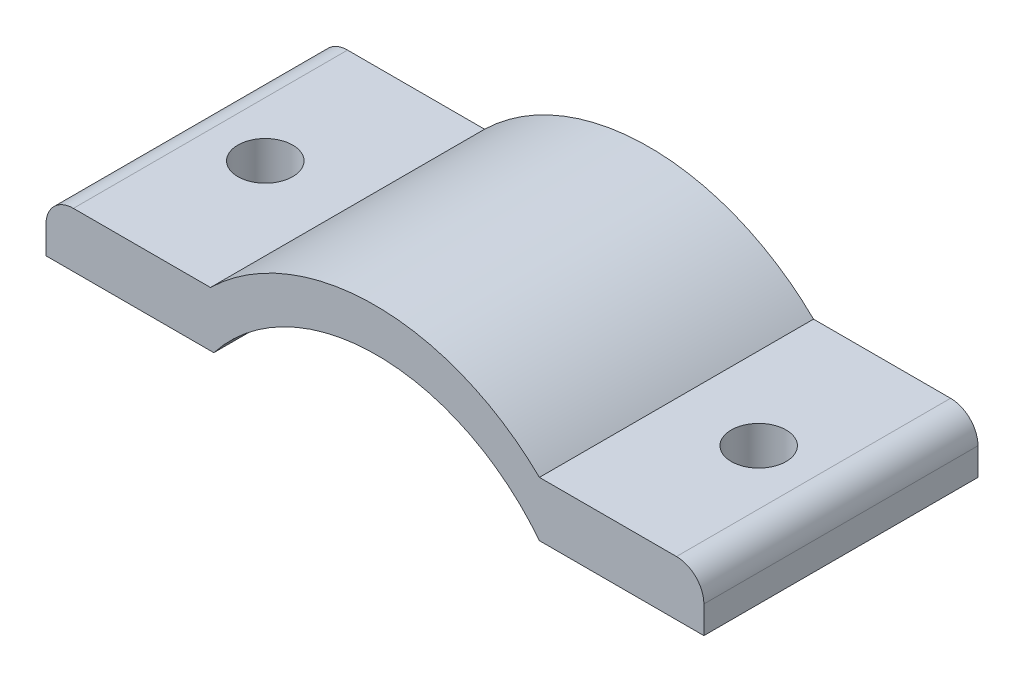
ISO-10303-21;
HEADER;
FILE_DESCRIPTION(('STEP AP214'),'2;1');
FILE_NAME('part.step','',(''),(''),'','','');
FILE_SCHEMA(('AUTOMOTIVE_DESIGN { 1 0 10303 214 1 1 1 1 }'));
ENDSEC;
DATA;
#1=APPLICATION_CONTEXT('core data for automotive mechanical design processes');
#2=APPLICATION_PROTOCOL_DEFINITION('international standard','automotive_design',2000,#1);
#3=PRODUCT_CONTEXT('',#1,'mechanical');
#4=PRODUCT('Part','Part','',(#3));
#5=PRODUCT_RELATED_PRODUCT_CATEGORY('part','',(#4));
#6=PRODUCT_DEFINITION_FORMATION('','',#4);
#7=PRODUCT_DEFINITION_CONTEXT('part definition',#1,'design');
#8=PRODUCT_DEFINITION('design','',#6,#7);
#9=PRODUCT_DEFINITION_SHAPE('','',#8);
#10=(LENGTH_UNIT() NAMED_UNIT(*) SI_UNIT(.MILLI.,.METRE.));
#11=(NAMED_UNIT(*) PLANE_ANGLE_UNIT() SI_UNIT($,.RADIAN.));
#12=(NAMED_UNIT(*) SI_UNIT($,.STERADIAN.) SOLID_ANGLE_UNIT());
#13=UNCERTAINTY_MEASURE_WITH_UNIT(LENGTH_MEASURE(1.E-05),#10,'distance_accuracy_value','');
#14=(GEOMETRIC_REPRESENTATION_CONTEXT(3) GLOBAL_UNCERTAINTY_ASSIGNED_CONTEXT((#13)) GLOBAL_UNIT_ASSIGNED_CONTEXT((#10,
#11,#12)) REPRESENTATION_CONTEXT('',''));
#15=CARTESIAN_POINT('',(0.,0.,0.));
#16=DIRECTION('',(0.,0.,1.));
#17=DIRECTION('',(1.,0.,0.));
#18=AXIS2_PLACEMENT_3D('',#15,#16,#17);
#19=CARTESIAN_POINT('',(-19.5403565974855,0.,10.));
#20=DIRECTION('',(0.,-1.,0.));
#21=DIRECTION('',(0.,0.,-1.));
#22=AXIS2_PLACEMENT_3D('',#19,#20,#21);
#23=PLANE('',#22);
#24=CARTESIAN_POINT('',(-16.5403565974855,0.,5.));
#25=DIRECTION('',(0.,1.,0.));
#26=DIRECTION('',(0.,0.,1.));
#27=AXIS2_PLACEMENT_3D('',#24,#25,#26);
#28=CIRCLE('',#27,1.);
#29=CARTESIAN_POINT('',(-16.5403565974855,0.,6.));
#30=VERTEX_POINT('',#29);
#31=EDGE_CURVE('E306',#30,#30,#28,.T.);
#32=ORIENTED_EDGE('',*,*,#31,.F.);
#33=EDGE_LOOP('',(#32));
#34=FACE_BOUND('',#33,.T.);
#35=DIRECTION('',(-1.,0.,0.));
#36=VECTOR('',#35,1.);
#37=CARTESIAN_POINT('',(-19.5403565974855,0.,0.));
#38=LINE('',#37,#36);
#39=CARTESIAN_POINT('',(-13.5403565974855,0.,0.));
#40=VERTEX_POINT('',#39);
#41=CARTESIAN_POINT('',(-18.5403565974855,0.,0.));
#42=VERTEX_POINT('',#41);
#43=EDGE_CURVE('E167',#40,#42,#38,.T.);
#44=ORIENTED_EDGE('',*,*,#43,.T.);
#45=DIRECTION('',(0.,0.,-1.));
#46=VECTOR('',#45,1.);
#47=CARTESIAN_POINT('',(-18.5403565974855,0.,10.));
#48=LINE('',#47,#46);
#49=CARTESIAN_POINT('',(-18.5403565974855,0.,10.));
#50=VERTEX_POINT('',#49);
#51=EDGE_CURVE('E11',#42,#50,#48,.F.);
#52=ORIENTED_EDGE('',*,*,#51,.T.);
#53=DIRECTION('',(-1.,0.,0.));
#54=VECTOR('',#53,1.);
#55=CARTESIAN_POINT('',(-19.5403565974855,0.,10.));
#56=LINE('',#55,#54);
#57=CARTESIAN_POINT('',(-13.5403565974855,0.,10.));
#58=VERTEX_POINT('',#57);
#59=EDGE_CURVE('E131',#58,#50,#56,.T.);
#60=ORIENTED_EDGE('',*,*,#59,.F.);
#61=DIRECTION('',(0.,0.,-1.));
#62=VECTOR('',#61,1.);
#63=CARTESIAN_POINT('',(-13.5403565974855,0.,10.));
#64=LINE('',#63,#62);
#65=EDGE_CURVE('E166',#58,#40,#64,.T.);
#66=ORIENTED_EDGE('',*,*,#65,.T.);
#67=EDGE_LOOP('',(#44,#52,#60,#66));
#68=FACE_BOUND('',#67,.T.);
#69=ADVANCED_FACE('F45',(#34,#68),#23,.F.);
#70=CARTESIAN_POINT('',(-19.5403565974855,0.,10.));
#71=DIRECTION('',(1.,0.,0.));
#72=DIRECTION('',(0.,0.,-1.));
#73=AXIS2_PLACEMENT_3D('',#70,#71,#72);
#74=PLANE('',#73);
#75=DIRECTION('',(0.,-1.,0.));
#76=VECTOR('',#75,1.);
#77=CARTESIAN_POINT('',(-19.5403565974855,0.,10.));
#78=LINE('',#77,#76);
#79=CARTESIAN_POINT('',(-19.5403565974855,-1.,10.));
#80=VERTEX_POINT('',#79);
#81=CARTESIAN_POINT('',(-19.5403565974855,-2.,10.));
#82=VERTEX_POINT('',#81);
#83=EDGE_CURVE('E120',#80,#82,#78,.T.);
#84=ORIENTED_EDGE('',*,*,#83,.F.);
#85=DIRECTION('',(0.,0.,-1.));
#86=VECTOR('',#85,1.);
#87=CARTESIAN_POINT('',(-19.5403565974855,-1.,10.));
#88=LINE('',#87,#86);
#89=CARTESIAN_POINT('',(-19.5403565974855,-1.,0.));
#90=VERTEX_POINT('',#89);
#91=EDGE_CURVE('E54',#80,#90,#88,.T.);
#92=ORIENTED_EDGE('',*,*,#91,.T.);
#93=DIRECTION('',(0.,-1.,0.));
#94=VECTOR('',#93,1.);
#95=CARTESIAN_POINT('',(-19.5403565974855,0.,0.));
#96=LINE('',#95,#94);
#97=CARTESIAN_POINT('',(-19.5403565974855,-2.,0.));
#98=VERTEX_POINT('',#97);
#99=EDGE_CURVE('E137',#90,#98,#96,.T.);
#100=ORIENTED_EDGE('',*,*,#99,.T.);
#101=DIRECTION('',(0.,0.,-1.));
#102=VECTOR('',#101,1.);
#103=CARTESIAN_POINT('',(-19.5403565974855,-2.,10.));
#104=LINE('',#103,#102);
#105=EDGE_CURVE('E134',#82,#98,#104,.T.);
#106=ORIENTED_EDGE('',*,*,#105,.F.);
#107=EDGE_LOOP('',(#84,#92,#100,#106));
#108=FACE_BOUND('',#107,.T.);
#109=ADVANCED_FACE('F135',(#108),#74,.F.);
#110=CARTESIAN_POINT('',(-19.5403565974855,-2.,10.));
#111=DIRECTION('',(0.,1.,0.));
#112=DIRECTION('',(0.,0.,1.));
#113=AXIS2_PLACEMENT_3D('',#110,#111,#112);
#114=PLANE('',#113);
#115=CARTESIAN_POINT('',(-16.5403565974855,-2.,5.));
#116=DIRECTION('',(0.,1.,0.));
#117=DIRECTION('',(0.,0.,1.));
#118=AXIS2_PLACEMENT_3D('',#115,#116,#117);
#119=CIRCLE('',#118,1.);
#120=CARTESIAN_POINT('',(-16.5403565974855,-2.,6.));
#121=VERTEX_POINT('',#120);
#122=EDGE_CURVE('E170',#121,#121,#119,.T.);
#123=ORIENTED_EDGE('',*,*,#122,.T.);
#124=EDGE_LOOP('',(#123));
#125=FACE_BOUND('',#124,.T.);
#126=DIRECTION('',(1.,0.,0.));
#127=VECTOR('',#126,1.);
#128=CARTESIAN_POINT('',(-19.5403565974855,-2.,0.));
#129=LINE('',#128,#127);
#130=CARTESIAN_POINT('',(-13.4187219149382,-2.,0.));
#131=VERTEX_POINT('',#130);
#132=EDGE_CURVE('E173',#98,#131,#129,.T.);
#133=ORIENTED_EDGE('',*,*,#132,.T.);
#134=DIRECTION('',(0.,0.,-1.));
#135=VECTOR('',#134,1.);
#136=CARTESIAN_POINT('',(-13.4187219149382,-2.,10.));
#137=LINE('',#136,#135);
#138=CARTESIAN_POINT('',(-13.4187219149382,-2.,10.));
#139=VERTEX_POINT('',#138);
#140=EDGE_CURVE('E142',#139,#131,#137,.T.);
#141=ORIENTED_EDGE('',*,*,#140,.F.);
#142=DIRECTION('',(1.,0.,0.));
#143=VECTOR('',#142,1.);
#144=CARTESIAN_POINT('',(-19.5403565974855,-2.,10.));
#145=LINE('',#144,#143);
#146=EDGE_CURVE('E125',#82,#139,#145,.T.);
#147=ORIENTED_EDGE('',*,*,#146,.F.);
#148=ORIENTED_EDGE('',*,*,#105,.T.);
#149=EDGE_LOOP('',(#133,#141,#147,#148));
#150=FACE_BOUND('',#149,.T.);
#151=ADVANCED_FACE('F144',(#125,#150),#114,.F.);
#152=CARTESIAN_POINT('',(-7.47953925621184,-6.63170528512345,10.));
#153=DIRECTION('',(0.,0.,-1.));
#154=DIRECTION('',(-1.,0.,0.));
#155=AXIS2_PLACEMENT_3D('',#152,#153,#154);
#156=CYLINDRICAL_SURFACE('',#155,7.53170528512345);
#157=CARTESIAN_POINT('',(-7.47953925621184,-6.63170528512345,0.));
#158=DIRECTION('',(0.,0.,-1.));
#159=DIRECTION('',(-1.,0.,0.));
#160=AXIS2_PLACEMENT_3D('',#157,#158,#159);
#161=CIRCLE('',#160,7.53170528512345);
#162=CARTESIAN_POINT('',(-1.54035659748547,-2.,0.));
#163=VERTEX_POINT('',#162);
#164=EDGE_CURVE('E176',#131,#163,#161,.T.);
#165=ORIENTED_EDGE('',*,*,#164,.T.);
#166=DIRECTION('',(0.,0.,-1.));
#167=VECTOR('',#166,1.);
#168=CARTESIAN_POINT('',(-1.54035659748547,-2.,10.));
#169=LINE('',#168,#167);
#170=CARTESIAN_POINT('',(-1.54035659748547,-2.,10.));
#171=VERTEX_POINT('',#170);
#172=EDGE_CURVE('E203',#171,#163,#169,.T.);
#173=ORIENTED_EDGE('',*,*,#172,.F.);
#174=CARTESIAN_POINT('',(-7.47953925621184,-6.63170528512345,10.));
#175=DIRECTION('',(0.,0.,-1.));
#176=DIRECTION('',(-1.,0.,0.));
#177=AXIS2_PLACEMENT_3D('',#174,#175,#176);
#178=CIRCLE('',#177,7.53170528512345);
#179=EDGE_CURVE('E148',#139,#171,#178,.T.);
#180=ORIENTED_EDGE('',*,*,#179,.F.);
#181=ORIENTED_EDGE('',*,*,#140,.T.);
#182=EDGE_LOOP('',(#165,#173,#180,#181));
#183=FACE_BOUND('',#182,.T.);
#184=ADVANCED_FACE('F238',(#183),#156,.F.);
#185=CARTESIAN_POINT('',(-1.54035659748547,-2.,10.));
#186=DIRECTION('',(0.,1.,0.));
#187=DIRECTION('',(0.,0.,1.));
#188=AXIS2_PLACEMENT_3D('',#185,#186,#187);
#189=PLANE('',#188);
#190=CARTESIAN_POINT('',(1.45964340251453,-2.,5.));
#191=DIRECTION('',(0.,1.,0.));
#192=DIRECTION('',(0.,0.,1.));
#193=AXIS2_PLACEMENT_3D('',#190,#191,#192);
#194=CIRCLE('',#193,1.);
#195=CARTESIAN_POINT('',(1.45964340251453,-2.,6.));
#196=VERTEX_POINT('',#195);
#197=EDGE_CURVE('E212',#196,#196,#194,.T.);
#198=ORIENTED_EDGE('',*,*,#197,.T.);
#199=EDGE_LOOP('',(#198));
#200=FACE_BOUND('',#199,.T.);
#201=DIRECTION('',(1.,0.,0.));
#202=VECTOR('',#201,1.);
#203=CARTESIAN_POINT('',(-1.54035659748547,-2.,0.));
#204=LINE('',#203,#202);
#205=CARTESIAN_POINT('',(4.45964340251453,-2.,0.));
#206=VERTEX_POINT('',#205);
#207=EDGE_CURVE('E179',#163,#206,#204,.T.);
#208=ORIENTED_EDGE('',*,*,#207,.T.);
#209=DIRECTION('',(0.,0.,-1.));
#210=VECTOR('',#209,1.);
#211=CARTESIAN_POINT('',(4.45964340251453,-2.,10.));
#212=LINE('',#211,#210);
#213=CARTESIAN_POINT('',(4.45964340251453,-2.,10.));
#214=VERTEX_POINT('',#213);
#215=EDGE_CURVE('E199',#214,#206,#212,.T.);
#216=ORIENTED_EDGE('',*,*,#215,.F.);
#217=DIRECTION('',(1.,0.,0.));
#218=VECTOR('',#217,1.);
#219=CARTESIAN_POINT('',(-1.54035659748547,-2.,10.));
#220=LINE('',#219,#218);
#221=EDGE_CURVE('E151',#171,#214,#220,.T.);
#222=ORIENTED_EDGE('',*,*,#221,.F.);
#223=ORIENTED_EDGE('',*,*,#172,.T.);
#224=EDGE_LOOP('',(#208,#216,#222,#223));
#225=FACE_BOUND('',#224,.T.);
#226=ADVANCED_FACE('F245',(#200,#225),#189,.F.);
#227=CARTESIAN_POINT('',(4.45964340251453,-2.,10.));
#228=DIRECTION('',(-1.,0.,0.));
#229=DIRECTION('',(0.,0.,1.));
#230=AXIS2_PLACEMENT_3D('',#227,#228,#229);
#231=PLANE('',#230);
#232=DIRECTION('',(0.,1.,0.));
#233=VECTOR('',#232,1.);
#234=CARTESIAN_POINT('',(4.45964340251453,-2.,0.));
#235=LINE('',#234,#233);
#236=CARTESIAN_POINT('',(4.45964340251453,-1.,0.));
#237=VERTEX_POINT('',#236);
#238=EDGE_CURVE('E182',#206,#237,#235,.T.);
#239=ORIENTED_EDGE('',*,*,#238,.T.);
#240=DIRECTION('',(0.,0.,-1.));
#241=VECTOR('',#240,1.);
#242=CARTESIAN_POINT('',(4.45964340251453,-1.,10.));
#243=LINE('',#242,#241);
#244=CARTESIAN_POINT('',(4.45964340251453,-1.,10.));
#245=VERTEX_POINT('',#244);
#246=EDGE_CURVE('E222',#237,#245,#243,.F.);
#247=ORIENTED_EDGE('',*,*,#246,.T.);
#248=DIRECTION('',(0.,1.,0.));
#249=VECTOR('',#248,1.);
#250=CARTESIAN_POINT('',(4.45964340251453,-2.,10.));
#251=LINE('',#250,#249);
#252=EDGE_CURVE('E157',#214,#245,#251,.T.);
#253=ORIENTED_EDGE('',*,*,#252,.F.);
#254=ORIENTED_EDGE('',*,*,#215,.T.);
#255=EDGE_LOOP('',(#239,#247,#253,#254));
#256=FACE_BOUND('',#255,.T.);
#257=ADVANCED_FACE('F248',(#256),#231,.F.);
#258=CARTESIAN_POINT('',(-1.54035659748547,0.,10.));
#259=DIRECTION('',(0.,-1.,0.));
#260=DIRECTION('',(0.,0.,-1.));
#261=AXIS2_PLACEMENT_3D('',#258,#259,#260);
#262=PLANE('',#261);
#263=CARTESIAN_POINT('',(1.45964340251453,0.,5.));
#264=DIRECTION('',(0.,1.,0.));
#265=DIRECTION('',(0.,0.,1.));
#266=AXIS2_PLACEMENT_3D('',#263,#264,#265);
#267=CIRCLE('',#266,1.);
#268=CARTESIAN_POINT('',(1.45964340251453,0.,6.));
#269=VERTEX_POINT('',#268);
#270=EDGE_CURVE('E309',#269,#269,#267,.T.);
#271=ORIENTED_EDGE('',*,*,#270,.F.);
#272=EDGE_LOOP('',(#271));
#273=FACE_BOUND('',#272,.T.);
#274=DIRECTION('',(-1.,0.,0.));
#275=VECTOR('',#274,1.);
#276=CARTESIAN_POINT('',(-1.54035659748547,0.,10.));
#277=LINE('',#276,#275);
#278=CARTESIAN_POINT('',(3.45964340251453,0.,10.));
#279=VERTEX_POINT('',#278);
#280=CARTESIAN_POINT('',(-1.54035659748547,0.,10.));
#281=VERTEX_POINT('',#280);
#282=EDGE_CURVE('E160',#279,#281,#277,.T.);
#283=ORIENTED_EDGE('',*,*,#282,.F.);
#284=DIRECTION('',(0.,0.,-1.));
#285=VECTOR('',#284,1.);
#286=CARTESIAN_POINT('',(3.45964340251453,0.,10.));
#287=LINE('',#286,#285);
#288=CARTESIAN_POINT('',(3.45964340251453,0.,0.));
#289=VERTEX_POINT('',#288);
#290=EDGE_CURVE('E141',#279,#289,#287,.T.);
#291=ORIENTED_EDGE('',*,*,#290,.T.);
#292=DIRECTION('',(-1.,0.,0.));
#293=VECTOR('',#292,1.);
#294=CARTESIAN_POINT('',(-1.54035659748547,0.,0.));
#295=LINE('',#294,#293);
#296=CARTESIAN_POINT('',(-1.54035659748547,0.,0.));
#297=VERTEX_POINT('',#296);
#298=EDGE_CURVE('E186',#289,#297,#295,.T.);
#299=ORIENTED_EDGE('',*,*,#298,.T.);
#300=DIRECTION('',(0.,0.,-1.));
#301=VECTOR('',#300,1.);
#302=CARTESIAN_POINT('',(-1.54035659748547,0.,10.));
#303=LINE('',#302,#301);
#304=EDGE_CURVE('E195',#281,#297,#303,.T.);
#305=ORIENTED_EDGE('',*,*,#304,.F.);
#306=EDGE_LOOP('',(#283,#291,#299,#305));
#307=FACE_BOUND('',#306,.T.);
#308=ADVANCED_FACE('F256',(#273,#307),#262,.F.);
#309=CARTESIAN_POINT('',(-7.54035659748547,-6.15716819664403,10.));
#310=DIRECTION('',(0.,0.,-1.));
#311=DIRECTION('',(-1.,0.,0.));
#312=AXIS2_PLACEMENT_3D('',#309,#310,#311);
#313=CYLINDRICAL_SURFACE('',#312,8.59713441803516);
#314=CARTESIAN_POINT('',(-7.54035659748547,-6.15716819664403,0.));
#315=DIRECTION('',(0.,0.,1.));
#316=DIRECTION('',(-1.,0.,0.));
#317=AXIS2_PLACEMENT_3D('',#314,#315,#316);
#318=CIRCLE('',#317,8.59713441803516);
#319=EDGE_CURVE('E189',#297,#40,#318,.T.);
#320=ORIENTED_EDGE('',*,*,#319,.T.);
#321=ORIENTED_EDGE('',*,*,#65,.F.);
#322=CARTESIAN_POINT('',(-7.54035659748547,-6.15716819664403,10.));
#323=DIRECTION('',(0.,0.,1.));
#324=DIRECTION('',(-1.,0.,0.));
#325=AXIS2_PLACEMENT_3D('',#322,#323,#324);
#326=CIRCLE('',#325,8.59713441803516);
#327=EDGE_CURVE('E163',#281,#58,#326,.T.);
#328=ORIENTED_EDGE('',*,*,#327,.F.);
#329=ORIENTED_EDGE('',*,*,#304,.T.);
#330=EDGE_LOOP('',(#320,#321,#328,#329));
#331=FACE_BOUND('',#330,.T.);
#332=ADVANCED_FACE('F261',(#331),#313,.T.);
#333=CARTESIAN_POINT('',(-7.54035659748547,-6.15716819664403,10.));
#334=DIRECTION('',(0.,0.,-1.));
#335=DIRECTION('',(-1.,0.,0.));
#336=AXIS2_PLACEMENT_3D('',#333,#334,#335);
#337=PLANE('',#336);
#338=ORIENTED_EDGE('',*,*,#252,.T.);
#339=CARTESIAN_POINT('',(3.45964340251453,-1.,10.));
#340=DIRECTION('',(0.,0.,-1.));
#341=DIRECTION('',(-1.,0.,0.));
#342=AXIS2_PLACEMENT_3D('',#339,#340,#341);
#343=CIRCLE('',#342,1.);
#344=EDGE_CURVE('E227',#245,#279,#343,.F.);
#345=ORIENTED_EDGE('',*,*,#344,.T.);
#346=ORIENTED_EDGE('',*,*,#282,.T.);
#347=ORIENTED_EDGE('',*,*,#327,.T.);
#348=ORIENTED_EDGE('',*,*,#59,.T.);
#349=CARTESIAN_POINT('',(-18.5403565974855,-1.,10.));
#350=DIRECTION('',(0.,0.,-1.));
#351=DIRECTION('',(-1.,0.,0.));
#352=AXIS2_PLACEMENT_3D('',#349,#350,#351);
#353=CIRCLE('',#352,1.);
#354=EDGE_CURVE('E61',#50,#80,#353,.F.);
#355=ORIENTED_EDGE('',*,*,#354,.T.);
#356=ORIENTED_EDGE('',*,*,#83,.T.);
#357=ORIENTED_EDGE('',*,*,#146,.T.);
#358=ORIENTED_EDGE('',*,*,#179,.T.);
#359=ORIENTED_EDGE('',*,*,#221,.T.);
#360=EDGE_LOOP('',(#338,#345,#346,#347,#348,#355,#356,#357,#358,#359));
#361=FACE_BOUND('',#360,.T.);
#362=ADVANCED_FACE('F123',(#361),#337,.F.);
#363=CARTESIAN_POINT('',(-7.54035659748547,-6.15716819664403,0.));
#364=DIRECTION('',(0.,0.,-1.));
#365=DIRECTION('',(-1.,0.,0.));
#366=AXIS2_PLACEMENT_3D('',#363,#364,#365);
#367=PLANE('',#366);
#368=ORIENTED_EDGE('',*,*,#298,.F.);
#369=CARTESIAN_POINT('',(3.45964340251453,-1.,0.));
#370=DIRECTION('',(0.,0.,-1.));
#371=DIRECTION('',(-1.,0.,0.));
#372=AXIS2_PLACEMENT_3D('',#369,#370,#371);
#373=CIRCLE('',#372,1.);
#374=EDGE_CURVE('E219',#289,#237,#373,.T.);
#375=ORIENTED_EDGE('',*,*,#374,.T.);
#376=ORIENTED_EDGE('',*,*,#238,.F.);
#377=ORIENTED_EDGE('',*,*,#207,.F.);
#378=ORIENTED_EDGE('',*,*,#164,.F.);
#379=ORIENTED_EDGE('',*,*,#132,.F.);
#380=ORIENTED_EDGE('',*,*,#99,.F.);
#381=CARTESIAN_POINT('',(-18.5403565974855,-1.,0.));
#382=DIRECTION('',(0.,0.,-1.));
#383=DIRECTION('',(-1.,0.,0.));
#384=AXIS2_PLACEMENT_3D('',#381,#382,#383);
#385=CIRCLE('',#384,1.);
#386=EDGE_CURVE('E216',#90,#42,#385,.T.);
#387=ORIENTED_EDGE('',*,*,#386,.T.);
#388=ORIENTED_EDGE('',*,*,#43,.F.);
#389=ORIENTED_EDGE('',*,*,#319,.F.);
#390=EDGE_LOOP('',(#368,#375,#376,#377,#378,#379,#380,#387,#388,#389));
#391=FACE_BOUND('',#390,.T.);
#392=ADVANCED_FACE('F233',(#391),#367,.T.);
#393=CARTESIAN_POINT('',(1.45964340251453,-10.,5.));
#394=DIRECTION('',(0.,1.,0.));
#395=DIRECTION('',(0.,0.,1.));
#396=AXIS2_PLACEMENT_3D('',#393,#394,#395);
#397=CYLINDRICAL_SURFACE('',#396,1.);
#398=ORIENTED_EDGE('',*,*,#270,.T.);
#399=EDGE_LOOP('',(#398));
#400=FACE_BOUND('',#399,.T.);
#401=ORIENTED_EDGE('',*,*,#197,.F.);
#402=EDGE_LOOP('',(#401));
#403=FACE_BOUND('',#402,.T.);
#404=ADVANCED_FACE('F295',(#400,#403),#397,.F.);
#405=CARTESIAN_POINT('',(-16.5403565974855,-10.,5.));
#406=DIRECTION('',(0.,1.,0.));
#407=DIRECTION('',(0.,0.,1.));
#408=AXIS2_PLACEMENT_3D('',#405,#406,#407);
#409=CYLINDRICAL_SURFACE('',#408,1.);
#410=ORIENTED_EDGE('',*,*,#31,.T.);
#411=EDGE_LOOP('',(#410));
#412=FACE_BOUND('',#411,.T.);
#413=ORIENTED_EDGE('',*,*,#122,.F.);
#414=EDGE_LOOP('',(#413));
#415=FACE_BOUND('',#414,.T.);
#416=ADVANCED_FACE('F267',(#412,#415),#409,.F.);
#417=CARTESIAN_POINT('',(3.45964340251453,-1.,10.));
#418=DIRECTION('',(0.,0.,-1.));
#419=DIRECTION('',(-1.,0.,0.));
#420=AXIS2_PLACEMENT_3D('',#417,#418,#419);
#421=CYLINDRICAL_SURFACE('',#420,1.);
#422=ORIENTED_EDGE('',*,*,#344,.F.);
#423=ORIENTED_EDGE('',*,*,#246,.F.);
#424=ORIENTED_EDGE('',*,*,#374,.F.);
#425=ORIENTED_EDGE('',*,*,#290,.F.);
#426=EDGE_LOOP('',(#422,#423,#424,#425));
#427=FACE_BOUND('',#426,.T.);
#428=ADVANCED_FACE('F251',(#427),#421,.T.);
#429=CARTESIAN_POINT('',(-18.5403565974855,-1.,10.));
#430=DIRECTION('',(0.,0.,-1.));
#431=DIRECTION('',(-1.,0.,0.));
#432=AXIS2_PLACEMENT_3D('',#429,#430,#431);
#433=CYLINDRICAL_SURFACE('',#432,1.);
#434=ORIENTED_EDGE('',*,*,#354,.F.);
#435=ORIENTED_EDGE('',*,*,#51,.F.);
#436=ORIENTED_EDGE('',*,*,#386,.F.);
#437=ORIENTED_EDGE('',*,*,#91,.F.);
#438=EDGE_LOOP('',(#434,#435,#436,#437));
#439=FACE_BOUND('',#438,.T.);
#440=ADVANCED_FACE('F47',(#439),#433,.T.);
#441=CLOSED_SHELL('',(#69,#109,#151,#184,#226,#257,#308,#332,#362,#392,#404,#416,#428,#440));
#442=MANIFOLD_SOLID_BREP('B2',#441);
#443=ADVANCED_BREP_SHAPE_REPRESENTATION('',(#18,#442),#14);
#444=SHAPE_DEFINITION_REPRESENTATION(#9,#443);
ENDSEC;
END-ISO-10303-21;
